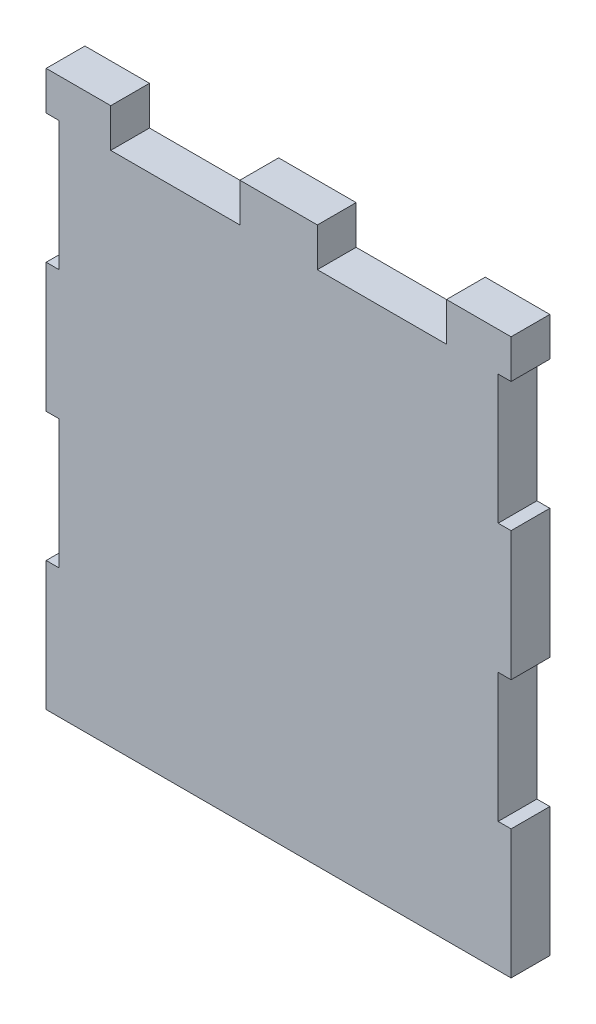
ISO-10303-21;
HEADER;
FILE_DESCRIPTION(('STEP AP214'),'2;1');
FILE_NAME('part.step','',(''),(''),'','','');
FILE_SCHEMA(('AUTOMOTIVE_DESIGN { 1 0 10303 214 1 1 1 1 }'));
ENDSEC;
DATA;
#1=APPLICATION_CONTEXT('core data for automotive mechanical design processes');
#2=APPLICATION_PROTOCOL_DEFINITION('international standard','automotive_design',2000,#1);
#3=PRODUCT_CONTEXT('',#1,'mechanical');
#4=PRODUCT('Part','Part','',(#3));
#5=PRODUCT_RELATED_PRODUCT_CATEGORY('part','',(#4));
#6=PRODUCT_DEFINITION_FORMATION('','',#4);
#7=PRODUCT_DEFINITION_CONTEXT('part definition',#1,'design');
#8=PRODUCT_DEFINITION('design','',#6,#7);
#9=PRODUCT_DEFINITION_SHAPE('','',#8);
#10=(LENGTH_UNIT() NAMED_UNIT(*) SI_UNIT(.MILLI.,.METRE.));
#11=(NAMED_UNIT(*) PLANE_ANGLE_UNIT() SI_UNIT($,.RADIAN.));
#12=(NAMED_UNIT(*) SI_UNIT($,.STERADIAN.) SOLID_ANGLE_UNIT());
#13=UNCERTAINTY_MEASURE_WITH_UNIT(LENGTH_MEASURE(1.E-05),#10,'distance_accuracy_value','');
#14=(GEOMETRIC_REPRESENTATION_CONTEXT(3) GLOBAL_UNCERTAINTY_ASSIGNED_CONTEXT((#13)) GLOBAL_UNIT_ASSIGNED_CONTEXT((#10,
#11,#12)) REPRESENTATION_CONTEXT('',''));
#15=CARTESIAN_POINT('',(0.,0.,0.));
#16=DIRECTION('',(0.,0.,1.));
#17=DIRECTION('',(1.,0.,0.));
#18=AXIS2_PLACEMENT_3D('',#15,#16,#17);
#19=CARTESIAN_POINT('',(0.,40.,3.));
#20=DIRECTION('',(0.,1.,0.));
#21=DIRECTION('',(0.,0.,1.));
#22=AXIS2_PLACEMENT_3D('',#19,#20,#21);
#23=PLANE('',#22);
#24=DIRECTION('',(1.,0.,0.));
#25=VECTOR('',#24,1.);
#26=CARTESIAN_POINT('',(0.,40.,0.));
#27=LINE('',#26,#25);
#28=CARTESIAN_POINT('',(21.,40.,0.));
#29=VERTEX_POINT('',#28);
#30=CARTESIAN_POINT('',(31.,40.,0.));
#31=VERTEX_POINT('',#30);
#32=EDGE_CURVE('E248',#29,#31,#27,.T.);
#33=ORIENTED_EDGE('',*,*,#32,.F.);
#34=DIRECTION('',(0.,0.,-1.));
#35=VECTOR('',#34,1.);
#36=CARTESIAN_POINT('',(21.,40.,3.));
#37=LINE('',#36,#35);
#38=CARTESIAN_POINT('',(21.,40.,3.));
#39=VERTEX_POINT('',#38);
#40=EDGE_CURVE('E11',#39,#29,#37,.T.);
#41=ORIENTED_EDGE('',*,*,#40,.F.);
#42=DIRECTION('',(1.,0.,0.));
#43=VECTOR('',#42,1.);
#44=CARTESIAN_POINT('',(0.,40.,3.));
#45=LINE('',#44,#43);
#46=CARTESIAN_POINT('',(31.,40.,3.));
#47=VERTEX_POINT('',#46);
#48=EDGE_CURVE('E322',#39,#47,#45,.T.);
#49=ORIENTED_EDGE('',*,*,#48,.T.);
#50=DIRECTION('',(0.,0.,-1.));
#51=VECTOR('',#50,1.);
#52=CARTESIAN_POINT('',(31.,40.,3.));
#53=LINE('',#52,#51);
#54=EDGE_CURVE('E51',#47,#31,#53,.T.);
#55=ORIENTED_EDGE('',*,*,#54,.T.);
#56=EDGE_LOOP('',(#33,#41,#49,#55));
#57=FACE_BOUND('',#56,.T.);
#58=ADVANCED_FACE('F35',(#57),#23,.T.);
#59=CARTESIAN_POINT('',(21.,0.,3.));
#60=DIRECTION('',(-1.,0.,0.));
#61=DIRECTION('',(0.,0.,1.));
#62=AXIS2_PLACEMENT_3D('',#59,#60,#61);
#63=PLANE('',#62);
#64=DIRECTION('',(0.,1.,0.));
#65=VECTOR('',#64,1.);
#66=CARTESIAN_POINT('',(21.,0.,0.));
#67=LINE('',#66,#65);
#68=CARTESIAN_POINT('',(21.,43.,0.));
#69=VERTEX_POINT('',#68);
#70=EDGE_CURVE('E250',#29,#69,#67,.T.);
#71=ORIENTED_EDGE('',*,*,#70,.T.);
#72=DIRECTION('',(0.,0.,-1.));
#73=VECTOR('',#72,1.);
#74=CARTESIAN_POINT('',(21.,43.,3.));
#75=LINE('',#74,#73);
#76=CARTESIAN_POINT('',(21.,43.,3.));
#77=VERTEX_POINT('',#76);
#78=EDGE_CURVE('E43',#77,#69,#75,.T.);
#79=ORIENTED_EDGE('',*,*,#78,.F.);
#80=DIRECTION('',(0.,1.,0.));
#81=VECTOR('',#80,1.);
#82=CARTESIAN_POINT('',(21.,0.,3.));
#83=LINE('',#82,#81);
#84=EDGE_CURVE('E394',#39,#77,#83,.T.);
#85=ORIENTED_EDGE('',*,*,#84,.F.);
#86=ORIENTED_EDGE('',*,*,#40,.T.);
#87=EDGE_LOOP('',(#71,#79,#85,#86));
#88=FACE_BOUND('',#87,.T.);
#89=ADVANCED_FACE('F381',(#88),#63,.F.);
#90=CARTESIAN_POINT('',(0.,43.,3.));
#91=DIRECTION('',(0.,1.,0.));
#92=DIRECTION('',(0.,0.,1.));
#93=AXIS2_PLACEMENT_3D('',#90,#91,#92);
#94=PLANE('',#93);
#95=DIRECTION('',(1.,0.,0.));
#96=VECTOR('',#95,1.);
#97=CARTESIAN_POINT('',(0.,43.,0.));
#98=LINE('',#97,#96);
#99=CARTESIAN_POINT('',(15.,43.,0.));
#100=VERTEX_POINT('',#99);
#101=EDGE_CURVE('E253',#100,#69,#98,.T.);
#102=ORIENTED_EDGE('',*,*,#101,.F.);
#103=DIRECTION('',(0.,0.,-1.));
#104=VECTOR('',#103,1.);
#105=CARTESIAN_POINT('',(15.,43.,3.));
#106=LINE('',#105,#104);
#107=CARTESIAN_POINT('',(15.,43.,3.));
#108=VERTEX_POINT('',#107);
#109=EDGE_CURVE('E371',#108,#100,#106,.T.);
#110=ORIENTED_EDGE('',*,*,#109,.F.);
#111=DIRECTION('',(1.,0.,0.));
#112=VECTOR('',#111,1.);
#113=CARTESIAN_POINT('',(0.,43.,3.));
#114=LINE('',#113,#112);
#115=EDGE_CURVE('E378',#108,#77,#114,.T.);
#116=ORIENTED_EDGE('',*,*,#115,.T.);
#117=ORIENTED_EDGE('',*,*,#78,.T.);
#118=EDGE_LOOP('',(#102,#110,#116,#117));
#119=FACE_BOUND('',#118,.T.);
#120=ADVANCED_FACE('F376',(#119),#94,.T.);
#121=CARTESIAN_POINT('',(15.,0.,3.));
#122=DIRECTION('',(-1.,0.,0.));
#123=DIRECTION('',(0.,0.,1.));
#124=AXIS2_PLACEMENT_3D('',#121,#122,#123);
#125=PLANE('',#124);
#126=DIRECTION('',(0.,1.,0.));
#127=VECTOR('',#126,1.);
#128=CARTESIAN_POINT('',(15.,0.,0.));
#129=LINE('',#128,#127);
#130=CARTESIAN_POINT('',(15.,40.,0.));
#131=VERTEX_POINT('',#130);
#132=EDGE_CURVE('E256',#131,#100,#129,.T.);
#133=ORIENTED_EDGE('',*,*,#132,.F.);
#134=DIRECTION('',(0.,0.,-1.));
#135=VECTOR('',#134,1.);
#136=CARTESIAN_POINT('',(15.,40.,3.));
#137=LINE('',#136,#135);
#138=CARTESIAN_POINT('',(15.,40.,3.));
#139=VERTEX_POINT('',#138);
#140=EDGE_CURVE('E369',#139,#131,#137,.T.);
#141=ORIENTED_EDGE('',*,*,#140,.F.);
#142=DIRECTION('',(0.,1.,0.));
#143=VECTOR('',#142,1.);
#144=CARTESIAN_POINT('',(15.,0.,3.));
#145=LINE('',#144,#143);
#146=EDGE_CURVE('E391',#139,#108,#145,.T.);
#147=ORIENTED_EDGE('',*,*,#146,.T.);
#148=ORIENTED_EDGE('',*,*,#109,.T.);
#149=EDGE_LOOP('',(#133,#141,#147,#148));
#150=FACE_BOUND('',#149,.T.);
#151=ADVANCED_FACE('F388',(#150),#125,.T.);
#152=CARTESIAN_POINT('',(0.,40.,3.));
#153=DIRECTION('',(0.,1.,0.));
#154=DIRECTION('',(0.,0.,1.));
#155=AXIS2_PLACEMENT_3D('',#152,#153,#154);
#156=PLANE('',#155);
#157=DIRECTION('',(1.,0.,0.));
#158=VECTOR('',#157,1.);
#159=CARTESIAN_POINT('',(0.,40.,0.));
#160=LINE('',#159,#158);
#161=CARTESIAN_POINT('',(5.,40.,0.));
#162=VERTEX_POINT('',#161);
#163=EDGE_CURVE('E259',#162,#131,#160,.T.);
#164=ORIENTED_EDGE('',*,*,#163,.F.);
#165=DIRECTION('',(0.,0.,-1.));
#166=VECTOR('',#165,1.);
#167=CARTESIAN_POINT('',(5.,40.,3.));
#168=LINE('',#167,#166);
#169=CARTESIAN_POINT('',(5.,40.,3.));
#170=VERTEX_POINT('',#169);
#171=EDGE_CURVE('E367',#170,#162,#168,.T.);
#172=ORIENTED_EDGE('',*,*,#171,.F.);
#173=DIRECTION('',(1.,0.,0.));
#174=VECTOR('',#173,1.);
#175=CARTESIAN_POINT('',(0.,40.,3.));
#176=LINE('',#175,#174);
#177=EDGE_CURVE('E396',#170,#139,#176,.T.);
#178=ORIENTED_EDGE('',*,*,#177,.T.);
#179=ORIENTED_EDGE('',*,*,#140,.T.);
#180=EDGE_LOOP('',(#164,#172,#178,#179));
#181=FACE_BOUND('',#180,.T.);
#182=ADVANCED_FACE('F480',(#181),#156,.T.);
#183=CARTESIAN_POINT('',(5.,0.,3.));
#184=DIRECTION('',(-1.,0.,0.));
#185=DIRECTION('',(0.,0.,1.));
#186=AXIS2_PLACEMENT_3D('',#183,#184,#185);
#187=PLANE('',#186);
#188=DIRECTION('',(0.,1.,0.));
#189=VECTOR('',#188,1.);
#190=CARTESIAN_POINT('',(5.,0.,0.));
#191=LINE('',#190,#189);
#192=CARTESIAN_POINT('',(5.,43.,0.));
#193=VERTEX_POINT('',#192);
#194=EDGE_CURVE('E262',#162,#193,#191,.T.);
#195=ORIENTED_EDGE('',*,*,#194,.T.);
#196=DIRECTION('',(0.,0.,-1.));
#197=VECTOR('',#196,1.);
#198=CARTESIAN_POINT('',(5.,43.,3.));
#199=LINE('',#198,#197);
#200=CARTESIAN_POINT('',(5.,43.,3.));
#201=VERTEX_POINT('',#200);
#202=EDGE_CURVE('E365',#201,#193,#199,.T.);
#203=ORIENTED_EDGE('',*,*,#202,.F.);
#204=DIRECTION('',(0.,1.,0.));
#205=VECTOR('',#204,1.);
#206=CARTESIAN_POINT('',(5.,0.,3.));
#207=LINE('',#206,#205);
#208=EDGE_CURVE('E402',#170,#201,#207,.T.);
#209=ORIENTED_EDGE('',*,*,#208,.F.);
#210=ORIENTED_EDGE('',*,*,#171,.T.);
#211=EDGE_LOOP('',(#195,#203,#209,#210));
#212=FACE_BOUND('',#211,.T.);
#213=ADVANCED_FACE('F483',(#212),#187,.F.);
#214=CARTESIAN_POINT('',(0.,43.,3.));
#215=DIRECTION('',(0.,1.,0.));
#216=DIRECTION('',(0.,0.,1.));
#217=AXIS2_PLACEMENT_3D('',#214,#215,#216);
#218=PLANE('',#217);
#219=DIRECTION('',(1.,0.,0.));
#220=VECTOR('',#219,1.);
#221=CARTESIAN_POINT('',(0.,43.,0.));
#222=LINE('',#221,#220);
#223=CARTESIAN_POINT('',(0.,43.,0.));
#224=VERTEX_POINT('',#223);
#225=EDGE_CURVE('E265',#224,#193,#222,.T.);
#226=ORIENTED_EDGE('',*,*,#225,.F.);
#227=DIRECTION('',(0.,0.,-1.));
#228=VECTOR('',#227,1.);
#229=CARTESIAN_POINT('',(0.,43.,3.));
#230=LINE('',#229,#228);
#231=CARTESIAN_POINT('',(0.,43.,3.));
#232=VERTEX_POINT('',#231);
#233=EDGE_CURVE('E363',#232,#224,#230,.T.);
#234=ORIENTED_EDGE('',*,*,#233,.F.);
#235=DIRECTION('',(1.,0.,0.));
#236=VECTOR('',#235,1.);
#237=CARTESIAN_POINT('',(0.,43.,3.));
#238=LINE('',#237,#236);
#239=EDGE_CURVE('E404',#232,#201,#238,.T.);
#240=ORIENTED_EDGE('',*,*,#239,.T.);
#241=ORIENTED_EDGE('',*,*,#202,.T.);
#242=EDGE_LOOP('',(#226,#234,#240,#241));
#243=FACE_BOUND('',#242,.T.);
#244=ADVANCED_FACE('F487',(#243),#218,.T.);
#245=CARTESIAN_POINT('',(0.,0.,3.));
#246=DIRECTION('',(-1.,0.,0.));
#247=DIRECTION('',(0.,0.,1.));
#248=AXIS2_PLACEMENT_3D('',#245,#246,#247);
#249=PLANE('',#248);
#250=DIRECTION('',(0.,1.,0.));
#251=VECTOR('',#250,1.);
#252=CARTESIAN_POINT('',(0.,0.,0.));
#253=LINE('',#252,#251);
#254=CARTESIAN_POINT('',(0.,40.,0.));
#255=VERTEX_POINT('',#254);
#256=EDGE_CURVE('E268',#255,#224,#253,.T.);
#257=ORIENTED_EDGE('',*,*,#256,.F.);
#258=DIRECTION('',(0.,0.,-1.));
#259=VECTOR('',#258,1.);
#260=CARTESIAN_POINT('',(0.,40.,3.));
#261=LINE('',#260,#259);
#262=CARTESIAN_POINT('',(0.,40.,3.));
#263=VERTEX_POINT('',#262);
#264=EDGE_CURVE('E361',#263,#255,#261,.T.);
#265=ORIENTED_EDGE('',*,*,#264,.F.);
#266=DIRECTION('',(0.,1.,0.));
#267=VECTOR('',#266,1.);
#268=CARTESIAN_POINT('',(0.,0.,3.));
#269=LINE('',#268,#267);
#270=EDGE_CURVE('E407',#263,#232,#269,.T.);
#271=ORIENTED_EDGE('',*,*,#270,.T.);
#272=ORIENTED_EDGE('',*,*,#233,.T.);
#273=EDGE_LOOP('',(#257,#265,#271,#272));
#274=FACE_BOUND('',#273,.T.);
#275=ADVANCED_FACE('F491',(#274),#249,.T.);
#276=CARTESIAN_POINT('',(0.,40.,3.));
#277=DIRECTION('',(0.,1.,0.));
#278=DIRECTION('',(0.,0.,1.));
#279=AXIS2_PLACEMENT_3D('',#276,#277,#278);
#280=PLANE('',#279);
#281=DIRECTION('',(1.,0.,0.));
#282=VECTOR('',#281,1.);
#283=CARTESIAN_POINT('',(0.,40.,0.));
#284=LINE('',#283,#282);
#285=CARTESIAN_POINT('',(1.,40.,0.));
#286=VERTEX_POINT('',#285);
#287=EDGE_CURVE('E271',#255,#286,#284,.T.);
#288=ORIENTED_EDGE('',*,*,#287,.T.);
#289=DIRECTION('',(0.,0.,-1.));
#290=VECTOR('',#289,1.);
#291=CARTESIAN_POINT('',(1.,40.,3.));
#292=LINE('',#291,#290);
#293=CARTESIAN_POINT('',(1.,40.,3.));
#294=VERTEX_POINT('',#293);
#295=EDGE_CURVE('E359',#294,#286,#292,.T.);
#296=ORIENTED_EDGE('',*,*,#295,.F.);
#297=DIRECTION('',(1.,0.,0.));
#298=VECTOR('',#297,1.);
#299=CARTESIAN_POINT('',(0.,40.,3.));
#300=LINE('',#299,#298);
#301=EDGE_CURVE('E410',#263,#294,#300,.T.);
#302=ORIENTED_EDGE('',*,*,#301,.F.);
#303=ORIENTED_EDGE('',*,*,#264,.T.);
#304=EDGE_LOOP('',(#288,#296,#302,#303));
#305=FACE_BOUND('',#304,.T.);
#306=ADVANCED_FACE('F495',(#305),#280,.F.);
#307=CARTESIAN_POINT('',(1.,0.,3.));
#308=DIRECTION('',(-1.,0.,0.));
#309=DIRECTION('',(0.,0.,1.));
#310=AXIS2_PLACEMENT_3D('',#307,#308,#309);
#311=PLANE('',#310);
#312=DIRECTION('',(0.,1.,0.));
#313=VECTOR('',#312,1.);
#314=CARTESIAN_POINT('',(1.,0.,0.));
#315=LINE('',#314,#313);
#316=CARTESIAN_POINT('',(1.,30.,0.));
#317=VERTEX_POINT('',#316);
#318=EDGE_CURVE('E274',#317,#286,#315,.T.);
#319=ORIENTED_EDGE('',*,*,#318,.F.);
#320=DIRECTION('',(0.,0.,-1.));
#321=VECTOR('',#320,1.);
#322=CARTESIAN_POINT('',(1.,30.,3.));
#323=LINE('',#322,#321);
#324=CARTESIAN_POINT('',(1.,30.,3.));
#325=VERTEX_POINT('',#324);
#326=EDGE_CURVE('E357',#325,#317,#323,.T.);
#327=ORIENTED_EDGE('',*,*,#326,.F.);
#328=DIRECTION('',(0.,1.,0.));
#329=VECTOR('',#328,1.);
#330=CARTESIAN_POINT('',(1.,0.,3.));
#331=LINE('',#330,#329);
#332=EDGE_CURVE('E412',#325,#294,#331,.T.);
#333=ORIENTED_EDGE('',*,*,#332,.T.);
#334=ORIENTED_EDGE('',*,*,#295,.T.);
#335=EDGE_LOOP('',(#319,#327,#333,#334));
#336=FACE_BOUND('',#335,.T.);
#337=ADVANCED_FACE('F499',(#336),#311,.T.);
#338=CARTESIAN_POINT('',(0.,30.,3.));
#339=DIRECTION('',(0.,1.,0.));
#340=DIRECTION('',(0.,0.,1.));
#341=AXIS2_PLACEMENT_3D('',#338,#339,#340);
#342=PLANE('',#341);
#343=DIRECTION('',(1.,0.,0.));
#344=VECTOR('',#343,1.);
#345=CARTESIAN_POINT('',(0.,30.,0.));
#346=LINE('',#345,#344);
#347=CARTESIAN_POINT('',(0.,30.,0.));
#348=VERTEX_POINT('',#347);
#349=EDGE_CURVE('E277',#348,#317,#346,.T.);
#350=ORIENTED_EDGE('',*,*,#349,.F.);
#351=DIRECTION('',(0.,0.,-1.));
#352=VECTOR('',#351,1.);
#353=CARTESIAN_POINT('',(0.,30.,3.));
#354=LINE('',#353,#352);
#355=CARTESIAN_POINT('',(0.,30.,3.));
#356=VERTEX_POINT('',#355);
#357=EDGE_CURVE('E355',#356,#348,#354,.T.);
#358=ORIENTED_EDGE('',*,*,#357,.F.);
#359=DIRECTION('',(1.,0.,0.));
#360=VECTOR('',#359,1.);
#361=CARTESIAN_POINT('',(0.,30.,3.));
#362=LINE('',#361,#360);
#363=EDGE_CURVE('E415',#356,#325,#362,.T.);
#364=ORIENTED_EDGE('',*,*,#363,.T.);
#365=ORIENTED_EDGE('',*,*,#326,.T.);
#366=EDGE_LOOP('',(#350,#358,#364,#365));
#367=FACE_BOUND('',#366,.T.);
#368=ADVANCED_FACE('F501',(#367),#342,.T.);
#369=CARTESIAN_POINT('',(0.,0.,3.));
#370=DIRECTION('',(-1.,0.,0.));
#371=DIRECTION('',(0.,0.,1.));
#372=AXIS2_PLACEMENT_3D('',#369,#370,#371);
#373=PLANE('',#372);
#374=DIRECTION('',(0.,1.,0.));
#375=VECTOR('',#374,1.);
#376=CARTESIAN_POINT('',(0.,0.,0.));
#377=LINE('',#376,#375);
#378=CARTESIAN_POINT('',(0.,20.,0.));
#379=VERTEX_POINT('',#378);
#380=EDGE_CURVE('E281',#379,#348,#377,.T.);
#381=ORIENTED_EDGE('',*,*,#380,.F.);
#382=DIRECTION('',(0.,0.,-1.));
#383=VECTOR('',#382,1.);
#384=CARTESIAN_POINT('',(0.,20.,3.));
#385=LINE('',#384,#383);
#386=CARTESIAN_POINT('',(0.,20.,3.));
#387=VERTEX_POINT('',#386);
#388=EDGE_CURVE('E353',#387,#379,#385,.T.);
#389=ORIENTED_EDGE('',*,*,#388,.F.);
#390=DIRECTION('',(0.,1.,0.));
#391=VECTOR('',#390,1.);
#392=CARTESIAN_POINT('',(0.,0.,3.));
#393=LINE('',#392,#391);
#394=EDGE_CURVE('E419',#387,#356,#393,.T.);
#395=ORIENTED_EDGE('',*,*,#394,.T.);
#396=ORIENTED_EDGE('',*,*,#357,.T.);
#397=EDGE_LOOP('',(#381,#389,#395,#396));
#398=FACE_BOUND('',#397,.T.);
#399=ADVANCED_FACE('F504',(#398),#373,.T.);
#400=CARTESIAN_POINT('',(0.,20.,3.));
#401=DIRECTION('',(0.,1.,0.));
#402=DIRECTION('',(0.,0.,1.));
#403=AXIS2_PLACEMENT_3D('',#400,#401,#402);
#404=PLANE('',#403);
#405=DIRECTION('',(1.,0.,0.));
#406=VECTOR('',#405,1.);
#407=CARTESIAN_POINT('',(0.,20.,0.));
#408=LINE('',#407,#406);
#409=CARTESIAN_POINT('',(1.,20.,0.));
#410=VERTEX_POINT('',#409);
#411=EDGE_CURVE('E284',#379,#410,#408,.T.);
#412=ORIENTED_EDGE('',*,*,#411,.T.);
#413=DIRECTION('',(0.,0.,-1.));
#414=VECTOR('',#413,1.);
#415=CARTESIAN_POINT('',(1.,20.,3.));
#416=LINE('',#415,#414);
#417=CARTESIAN_POINT('',(1.,20.,3.));
#418=VERTEX_POINT('',#417);
#419=EDGE_CURVE('E351',#418,#410,#416,.T.);
#420=ORIENTED_EDGE('',*,*,#419,.F.);
#421=DIRECTION('',(1.,0.,0.));
#422=VECTOR('',#421,1.);
#423=CARTESIAN_POINT('',(0.,20.,3.));
#424=LINE('',#423,#422);
#425=EDGE_CURVE('E422',#387,#418,#424,.T.);
#426=ORIENTED_EDGE('',*,*,#425,.F.);
#427=ORIENTED_EDGE('',*,*,#388,.T.);
#428=EDGE_LOOP('',(#412,#420,#426,#427));
#429=FACE_BOUND('',#428,.T.);
#430=ADVANCED_FACE('F508',(#429),#404,.F.);
#431=CARTESIAN_POINT('',(1.,10.,0.));
#432=VERTEX_POINT('',#431);
#433=EDGE_CURVE('E278',#432,#410,#315,.T.);
#434=ORIENTED_EDGE('',*,*,#433,.F.);
#435=DIRECTION('',(0.,0.,-1.));
#436=VECTOR('',#435,1.);
#437=CARTESIAN_POINT('',(1.,10.,3.));
#438=LINE('',#437,#436);
#439=CARTESIAN_POINT('',(1.,10.,3.));
#440=VERTEX_POINT('',#439);
#441=EDGE_CURVE('E349',#440,#432,#438,.T.);
#442=ORIENTED_EDGE('',*,*,#441,.F.);
#443=EDGE_CURVE('E416',#440,#418,#331,.T.);
#444=ORIENTED_EDGE('',*,*,#443,.T.);
#445=ORIENTED_EDGE('',*,*,#419,.T.);
#446=EDGE_LOOP('',(#434,#442,#444,#445));
#447=FACE_BOUND('',#446,.T.);
#448=ADVANCED_FACE('F512',(#447),#311,.T.);
#449=CARTESIAN_POINT('',(0.,10.,3.));
#450=DIRECTION('',(0.,1.,0.));
#451=DIRECTION('',(0.,0.,1.));
#452=AXIS2_PLACEMENT_3D('',#449,#450,#451);
#453=PLANE('',#452);
#454=DIRECTION('',(1.,0.,0.));
#455=VECTOR('',#454,1.);
#456=CARTESIAN_POINT('',(0.,10.,0.));
#457=LINE('',#456,#455);
#458=CARTESIAN_POINT('',(0.,10.,0.));
#459=VERTEX_POINT('',#458);
#460=EDGE_CURVE('E287',#459,#432,#457,.T.);
#461=ORIENTED_EDGE('',*,*,#460,.F.);
#462=DIRECTION('',(0.,0.,-1.));
#463=VECTOR('',#462,1.);
#464=CARTESIAN_POINT('',(0.,10.,3.));
#465=LINE('',#464,#463);
#466=CARTESIAN_POINT('',(0.,10.,3.));
#467=VERTEX_POINT('',#466);
#468=EDGE_CURVE('E347',#467,#459,#465,.T.);
#469=ORIENTED_EDGE('',*,*,#468,.F.);
#470=DIRECTION('',(1.,0.,0.));
#471=VECTOR('',#470,1.);
#472=CARTESIAN_POINT('',(0.,10.,3.));
#473=LINE('',#472,#471);
#474=EDGE_CURVE('E424',#467,#440,#473,.T.);
#475=ORIENTED_EDGE('',*,*,#474,.T.);
#476=ORIENTED_EDGE('',*,*,#441,.T.);
#477=EDGE_LOOP('',(#461,#469,#475,#476));
#478=FACE_BOUND('',#477,.T.);
#479=ADVANCED_FACE('F516',(#478),#453,.T.);
#480=CARTESIAN_POINT('',(0.,0.,3.));
#481=DIRECTION('',(-1.,0.,0.));
#482=DIRECTION('',(0.,0.,1.));
#483=AXIS2_PLACEMENT_3D('',#480,#481,#482);
#484=PLANE('',#483);
#485=DIRECTION('',(0.,1.,0.));
#486=VECTOR('',#485,1.);
#487=CARTESIAN_POINT('',(0.,0.,0.));
#488=LINE('',#487,#486);
#489=CARTESIAN_POINT('',(0.,0.,0.));
#490=VERTEX_POINT('',#489);
#491=EDGE_CURVE('E290',#490,#459,#488,.T.);
#492=ORIENTED_EDGE('',*,*,#491,.F.);
#493=DIRECTION('',(0.,0.,-1.));
#494=VECTOR('',#493,1.);
#495=CARTESIAN_POINT('',(0.,0.,3.));
#496=LINE('',#495,#494);
#497=CARTESIAN_POINT('',(0.,0.,3.));
#498=VERTEX_POINT('',#497);
#499=EDGE_CURVE('E345',#498,#490,#496,.T.);
#500=ORIENTED_EDGE('',*,*,#499,.F.);
#501=DIRECTION('',(0.,1.,0.));
#502=VECTOR('',#501,1.);
#503=CARTESIAN_POINT('',(0.,0.,3.));
#504=LINE('',#503,#502);
#505=EDGE_CURVE('E427',#498,#467,#504,.T.);
#506=ORIENTED_EDGE('',*,*,#505,.T.);
#507=ORIENTED_EDGE('',*,*,#468,.T.);
#508=EDGE_LOOP('',(#492,#500,#506,#507));
#509=FACE_BOUND('',#508,.T.);
#510=ADVANCED_FACE('F520',(#509),#484,.T.);
#511=CARTESIAN_POINT('',(0.,0.,3.));
#512=DIRECTION('',(0.,-1.,0.));
#513=DIRECTION('',(1.,0.,0.));
#514=AXIS2_PLACEMENT_3D('',#511,#512,#513);
#515=PLANE('',#514);
#516=DIRECTION('',(-1.,0.,0.));
#517=VECTOR('',#516,1.);
#518=CARTESIAN_POINT('',(0.,0.,0.));
#519=LINE('',#518,#517);
#520=CARTESIAN_POINT('',(36.,0.,0.));
#521=VERTEX_POINT('',#520);
#522=EDGE_CURVE('E293',#521,#490,#519,.T.);
#523=ORIENTED_EDGE('',*,*,#522,.F.);
#524=DIRECTION('',(0.,0.,-1.));
#525=VECTOR('',#524,1.);
#526=CARTESIAN_POINT('',(36.,0.,3.));
#527=LINE('',#526,#525);
#528=CARTESIAN_POINT('',(36.,0.,3.));
#529=VERTEX_POINT('',#528);
#530=EDGE_CURVE('E343',#529,#521,#527,.T.);
#531=ORIENTED_EDGE('',*,*,#530,.F.);
#532=DIRECTION('',(-1.,0.,0.));
#533=VECTOR('',#532,1.);
#534=CARTESIAN_POINT('',(0.,0.,3.));
#535=LINE('',#534,#533);
#536=EDGE_CURVE('E430',#529,#498,#535,.T.);
#537=ORIENTED_EDGE('',*,*,#536,.T.);
#538=ORIENTED_EDGE('',*,*,#499,.T.);
#539=EDGE_LOOP('',(#523,#531,#537,#538));
#540=FACE_BOUND('',#539,.T.);
#541=ADVANCED_FACE('F524',(#540),#515,.T.);
#542=CARTESIAN_POINT('',(36.,0.,3.));
#543=DIRECTION('',(1.,0.,0.));
#544=DIRECTION('',(0.,1.,0.));
#545=AXIS2_PLACEMENT_3D('',#542,#543,#544);
#546=PLANE('',#545);
#547=DIRECTION('',(0.,-1.,0.));
#548=VECTOR('',#547,1.);
#549=CARTESIAN_POINT('',(36.,0.,0.));
#550=LINE('',#549,#548);
#551=CARTESIAN_POINT('',(36.,10.,0.));
#552=VERTEX_POINT('',#551);
#553=EDGE_CURVE('E296',#552,#521,#550,.T.);
#554=ORIENTED_EDGE('',*,*,#553,.F.);
#555=DIRECTION('',(0.,0.,-1.));
#556=VECTOR('',#555,1.);
#557=CARTESIAN_POINT('',(36.,10.,3.));
#558=LINE('',#557,#556);
#559=CARTESIAN_POINT('',(36.,10.,3.));
#560=VERTEX_POINT('',#559);
#561=EDGE_CURVE('E341',#560,#552,#558,.T.);
#562=ORIENTED_EDGE('',*,*,#561,.F.);
#563=DIRECTION('',(0.,-1.,0.));
#564=VECTOR('',#563,1.);
#565=CARTESIAN_POINT('',(36.,0.,3.));
#566=LINE('',#565,#564);
#567=EDGE_CURVE('E433',#560,#529,#566,.T.);
#568=ORIENTED_EDGE('',*,*,#567,.T.);
#569=ORIENTED_EDGE('',*,*,#530,.T.);
#570=EDGE_LOOP('',(#554,#562,#568,#569));
#571=FACE_BOUND('',#570,.T.);
#572=ADVANCED_FACE('F528',(#571),#546,.T.);
#573=CARTESIAN_POINT('',(0.,9.99999999999988,3.));
#574=DIRECTION('',(0.,-1.,0.));
#575=DIRECTION('',(1.,0.,0.));
#576=AXIS2_PLACEMENT_3D('',#573,#574,#575);
#577=PLANE('',#576);
#578=DIRECTION('',(-1.,0.,0.));
#579=VECTOR('',#578,1.);
#580=CARTESIAN_POINT('',(0.,9.99999999999988,0.));
#581=LINE('',#580,#579);
#582=CARTESIAN_POINT('',(35.,10.,0.));
#583=VERTEX_POINT('',#582);
#584=EDGE_CURVE('E299',#552,#583,#581,.T.);
#585=ORIENTED_EDGE('',*,*,#584,.T.);
#586=DIRECTION('',(0.,0.,-1.));
#587=VECTOR('',#586,1.);
#588=CARTESIAN_POINT('',(35.,10.,3.));
#589=LINE('',#588,#587);
#590=CARTESIAN_POINT('',(35.,10.,3.));
#591=VERTEX_POINT('',#590);
#592=EDGE_CURVE('E338',#591,#583,#589,.T.);
#593=ORIENTED_EDGE('',*,*,#592,.F.);
#594=DIRECTION('',(-1.,0.,0.));
#595=VECTOR('',#594,1.);
#596=CARTESIAN_POINT('',(0.,9.99999999999988,3.));
#597=LINE('',#596,#595);
#598=EDGE_CURVE('E436',#560,#591,#597,.T.);
#599=ORIENTED_EDGE('',*,*,#598,.F.);
#600=ORIENTED_EDGE('',*,*,#561,.T.);
#601=EDGE_LOOP('',(#585,#593,#599,#600));
#602=FACE_BOUND('',#601,.T.);
#603=ADVANCED_FACE('F532',(#602),#577,.F.);
#604=CARTESIAN_POINT('',(35.,0.,3.));
#605=DIRECTION('',(-1.,0.,0.));
#606=DIRECTION('',(0.,0.,1.));
#607=AXIS2_PLACEMENT_3D('',#604,#605,#606);
#608=PLANE('',#607);
#609=DIRECTION('',(0.,1.,0.));
#610=VECTOR('',#609,1.);
#611=CARTESIAN_POINT('',(35.,0.,0.));
#612=LINE('',#611,#610);
#613=CARTESIAN_POINT('',(35.,20.,0.));
#614=VERTEX_POINT('',#613);
#615=EDGE_CURVE('E301',#583,#614,#612,.T.);
#616=ORIENTED_EDGE('',*,*,#615,.T.);
#617=DIRECTION('',(0.,0.,-1.));
#618=VECTOR('',#617,1.);
#619=CARTESIAN_POINT('',(35.,20.,3.));
#620=LINE('',#619,#618);
#621=CARTESIAN_POINT('',(35.,20.,3.));
#622=VERTEX_POINT('',#621);
#623=EDGE_CURVE('E336',#622,#614,#620,.T.);
#624=ORIENTED_EDGE('',*,*,#623,.F.);
#625=DIRECTION('',(0.,1.,0.));
#626=VECTOR('',#625,1.);
#627=CARTESIAN_POINT('',(35.,0.,3.));
#628=LINE('',#627,#626);
#629=EDGE_CURVE('E438',#591,#622,#628,.T.);
#630=ORIENTED_EDGE('',*,*,#629,.F.);
#631=ORIENTED_EDGE('',*,*,#592,.T.);
#632=EDGE_LOOP('',(#616,#624,#630,#631));
#633=FACE_BOUND('',#632,.T.);
#634=ADVANCED_FACE('F536',(#633),#608,.F.);
#635=CARTESIAN_POINT('',(0.,20.,3.));
#636=DIRECTION('',(0.,-1.,0.));
#637=DIRECTION('',(0.,0.,-1.));
#638=AXIS2_PLACEMENT_3D('',#635,#636,#637);
#639=PLANE('',#638);
#640=DIRECTION('',(-1.,0.,0.));
#641=VECTOR('',#640,1.);
#642=CARTESIAN_POINT('',(0.,20.,0.));
#643=LINE('',#642,#641);
#644=CARTESIAN_POINT('',(36.,20.,0.));
#645=VERTEX_POINT('',#644);
#646=EDGE_CURVE('E304',#645,#614,#643,.T.);
#647=ORIENTED_EDGE('',*,*,#646,.F.);
#648=DIRECTION('',(0.,0.,-1.));
#649=VECTOR('',#648,1.);
#650=CARTESIAN_POINT('',(36.,20.,3.));
#651=LINE('',#650,#649);
#652=CARTESIAN_POINT('',(36.,20.,3.));
#653=VERTEX_POINT('',#652);
#654=EDGE_CURVE('E334',#653,#645,#651,.T.);
#655=ORIENTED_EDGE('',*,*,#654,.F.);
#656=DIRECTION('',(-1.,0.,0.));
#657=VECTOR('',#656,1.);
#658=CARTESIAN_POINT('',(0.,20.,3.));
#659=LINE('',#658,#657);
#660=EDGE_CURVE('E440',#653,#622,#659,.T.);
#661=ORIENTED_EDGE('',*,*,#660,.T.);
#662=ORIENTED_EDGE('',*,*,#623,.T.);
#663=EDGE_LOOP('',(#647,#655,#661,#662));
#664=FACE_BOUND('',#663,.T.);
#665=ADVANCED_FACE('F538',(#664),#639,.T.);
#666=CARTESIAN_POINT('',(36.,0.,3.));
#667=DIRECTION('',(1.,0.,0.));
#668=DIRECTION('',(0.,1.,0.));
#669=AXIS2_PLACEMENT_3D('',#666,#667,#668);
#670=PLANE('',#669);
#671=DIRECTION('',(0.,-1.,0.));
#672=VECTOR('',#671,1.);
#673=CARTESIAN_POINT('',(36.,0.,0.));
#674=LINE('',#673,#672);
#675=CARTESIAN_POINT('',(36.,30.,0.));
#676=VERTEX_POINT('',#675);
#677=EDGE_CURVE('E308',#676,#645,#674,.T.);
#678=ORIENTED_EDGE('',*,*,#677,.F.);
#679=DIRECTION('',(0.,0.,-1.));
#680=VECTOR('',#679,1.);
#681=CARTESIAN_POINT('',(36.,30.,3.));
#682=LINE('',#681,#680);
#683=CARTESIAN_POINT('',(36.,30.,3.));
#684=VERTEX_POINT('',#683);
#685=EDGE_CURVE('E332',#684,#676,#682,.T.);
#686=ORIENTED_EDGE('',*,*,#685,.F.);
#687=DIRECTION('',(0.,-1.,0.));
#688=VECTOR('',#687,1.);
#689=CARTESIAN_POINT('',(36.,0.,3.));
#690=LINE('',#689,#688);
#691=EDGE_CURVE('E444',#684,#653,#690,.T.);
#692=ORIENTED_EDGE('',*,*,#691,.T.);
#693=ORIENTED_EDGE('',*,*,#654,.T.);
#694=EDGE_LOOP('',(#678,#686,#692,#693));
#695=FACE_BOUND('',#694,.T.);
#696=ADVANCED_FACE('F541',(#695),#670,.T.);
#697=CARTESIAN_POINT('',(0.,30.,3.));
#698=DIRECTION('',(0.,-1.,0.));
#699=DIRECTION('',(0.,0.,-1.));
#700=AXIS2_PLACEMENT_3D('',#697,#698,#699);
#701=PLANE('',#700);
#702=DIRECTION('',(-1.,0.,0.));
#703=VECTOR('',#702,1.);
#704=CARTESIAN_POINT('',(0.,30.,0.));
#705=LINE('',#704,#703);
#706=CARTESIAN_POINT('',(35.,30.,0.));
#707=VERTEX_POINT('',#706);
#708=EDGE_CURVE('E311',#676,#707,#705,.T.);
#709=ORIENTED_EDGE('',*,*,#708,.T.);
#710=DIRECTION('',(0.,0.,-1.));
#711=VECTOR('',#710,1.);
#712=CARTESIAN_POINT('',(35.,30.,3.));
#713=LINE('',#712,#711);
#714=CARTESIAN_POINT('',(35.,30.,3.));
#715=VERTEX_POINT('',#714);
#716=EDGE_CURVE('E329',#715,#707,#713,.T.);
#717=ORIENTED_EDGE('',*,*,#716,.F.);
#718=DIRECTION('',(-1.,0.,0.));
#719=VECTOR('',#718,1.);
#720=CARTESIAN_POINT('',(0.,30.,3.));
#721=LINE('',#720,#719);
#722=EDGE_CURVE('E447',#684,#715,#721,.T.);
#723=ORIENTED_EDGE('',*,*,#722,.F.);
#724=ORIENTED_EDGE('',*,*,#685,.T.);
#725=EDGE_LOOP('',(#709,#717,#723,#724));
#726=FACE_BOUND('',#725,.T.);
#727=ADVANCED_FACE('F545',(#726),#701,.F.);
#728=CARTESIAN_POINT('',(35.,40.,0.));
#729=VERTEX_POINT('',#728);
#730=EDGE_CURVE('E305',#707,#729,#612,.T.);
#731=ORIENTED_EDGE('',*,*,#730,.T.);
#732=DIRECTION('',(0.,0.,-1.));
#733=VECTOR('',#732,1.);
#734=CARTESIAN_POINT('',(35.,40.,3.));
#735=LINE('',#734,#733);
#736=CARTESIAN_POINT('',(35.,40.,3.));
#737=VERTEX_POINT('',#736);
#738=EDGE_CURVE('E326',#737,#729,#735,.T.);
#739=ORIENTED_EDGE('',*,*,#738,.F.);
#740=EDGE_CURVE('E441',#715,#737,#628,.T.);
#741=ORIENTED_EDGE('',*,*,#740,.F.);
#742=ORIENTED_EDGE('',*,*,#716,.T.);
#743=EDGE_LOOP('',(#731,#739,#741,#742));
#744=FACE_BOUND('',#743,.T.);
#745=ADVANCED_FACE('F454',(#744),#608,.F.);
#746=CARTESIAN_POINT('',(0.,40.,3.));
#747=DIRECTION('',(0.,1.,0.));
#748=DIRECTION('',(0.,0.,1.));
#749=AXIS2_PLACEMENT_3D('',#746,#747,#748);
#750=PLANE('',#749);
#751=DIRECTION('',(1.,0.,0.));
#752=VECTOR('',#751,1.);
#753=CARTESIAN_POINT('',(0.,40.,0.));
#754=LINE('',#753,#752);
#755=CARTESIAN_POINT('',(36.,40.,0.));
#756=VERTEX_POINT('',#755);
#757=EDGE_CURVE('E313',#729,#756,#754,.T.);
#758=ORIENTED_EDGE('',*,*,#757,.T.);
#759=DIRECTION('',(0.,0.,-1.));
#760=VECTOR('',#759,1.);
#761=CARTESIAN_POINT('',(36.,40.,3.));
#762=LINE('',#761,#760);
#763=CARTESIAN_POINT('',(36.,40.,3.));
#764=VERTEX_POINT('',#763);
#765=EDGE_CURVE('E230',#764,#756,#762,.T.);
#766=ORIENTED_EDGE('',*,*,#765,.F.);
#767=DIRECTION('',(1.,0.,0.));
#768=VECTOR('',#767,1.);
#769=CARTESIAN_POINT('',(0.,40.,3.));
#770=LINE('',#769,#768);
#771=EDGE_CURVE('E239',#737,#764,#770,.T.);
#772=ORIENTED_EDGE('',*,*,#771,.F.);
#773=ORIENTED_EDGE('',*,*,#738,.T.);
#774=EDGE_LOOP('',(#758,#766,#772,#773));
#775=FACE_BOUND('',#774,.T.);
#776=ADVANCED_FACE('F458',(#775),#750,.F.);
#777=CARTESIAN_POINT('',(36.,0.,3.));
#778=DIRECTION('',(1.,0.,0.));
#779=DIRECTION('',(0.,0.,-1.));
#780=AXIS2_PLACEMENT_3D('',#777,#778,#779);
#781=PLANE('',#780);
#782=DIRECTION('',(0.,-1.,0.));
#783=VECTOR('',#782,1.);
#784=CARTESIAN_POINT('',(36.,0.,0.));
#785=LINE('',#784,#783);
#786=CARTESIAN_POINT('',(36.,43.,0.));
#787=VERTEX_POINT('',#786);
#788=EDGE_CURVE('E226',#787,#756,#785,.T.);
#789=ORIENTED_EDGE('',*,*,#788,.F.);
#790=DIRECTION('',(0.,0.,-1.));
#791=VECTOR('',#790,1.);
#792=CARTESIAN_POINT('',(36.,43.,3.));
#793=LINE('',#792,#791);
#794=CARTESIAN_POINT('',(36.,43.,3.));
#795=VERTEX_POINT('',#794);
#796=EDGE_CURVE('E221',#795,#787,#793,.T.);
#797=ORIENTED_EDGE('',*,*,#796,.F.);
#798=DIRECTION('',(0.,-1.,0.));
#799=VECTOR('',#798,1.);
#800=CARTESIAN_POINT('',(36.,0.,3.));
#801=LINE('',#800,#799);
#802=EDGE_CURVE('E224',#795,#764,#801,.T.);
#803=ORIENTED_EDGE('',*,*,#802,.T.);
#804=ORIENTED_EDGE('',*,*,#765,.T.);
#805=EDGE_LOOP('',(#789,#797,#803,#804));
#806=FACE_BOUND('',#805,.T.);
#807=ADVANCED_FACE('F223',(#806),#781,.T.);
#808=CARTESIAN_POINT('',(0.,43.,3.));
#809=DIRECTION('',(0.,1.,0.));
#810=DIRECTION('',(0.,0.,1.));
#811=AXIS2_PLACEMENT_3D('',#808,#809,#810);
#812=PLANE('',#811);
#813=DIRECTION('',(1.,0.,0.));
#814=VECTOR('',#813,1.);
#815=CARTESIAN_POINT('',(0.,43.,0.));
#816=LINE('',#815,#814);
#817=CARTESIAN_POINT('',(31.,43.,0.));
#818=VERTEX_POINT('',#817);
#819=EDGE_CURVE('E317',#818,#787,#816,.T.);
#820=ORIENTED_EDGE('',*,*,#819,.F.);
#821=DIRECTION('',(0.,0.,-1.));
#822=VECTOR('',#821,1.);
#823=CARTESIAN_POINT('',(31.,43.,3.));
#824=LINE('',#823,#822);
#825=CARTESIAN_POINT('',(31.,43.,3.));
#826=VERTEX_POINT('',#825);
#827=EDGE_CURVE('E136',#826,#818,#824,.T.);
#828=ORIENTED_EDGE('',*,*,#827,.F.);
#829=DIRECTION('',(1.,0.,0.));
#830=VECTOR('',#829,1.);
#831=CARTESIAN_POINT('',(0.,43.,3.));
#832=LINE('',#831,#830);
#833=EDGE_CURVE('E237',#826,#795,#832,.T.);
#834=ORIENTED_EDGE('',*,*,#833,.T.);
#835=ORIENTED_EDGE('',*,*,#796,.T.);
#836=EDGE_LOOP('',(#820,#828,#834,#835));
#837=FACE_BOUND('',#836,.T.);
#838=ADVANCED_FACE('F242',(#837),#812,.T.);
#839=CARTESIAN_POINT('',(31.,0.,3.));
#840=DIRECTION('',(-1.,0.,0.));
#841=DIRECTION('',(0.,0.,1.));
#842=AXIS2_PLACEMENT_3D('',#839,#840,#841);
#843=PLANE('',#842);
#844=DIRECTION('',(0.,1.,0.));
#845=VECTOR('',#844,1.);
#846=CARTESIAN_POINT('',(31.,0.,0.));
#847=LINE('',#846,#845);
#848=EDGE_CURVE('E319',#31,#818,#847,.T.);
#849=ORIENTED_EDGE('',*,*,#848,.F.);
#850=ORIENTED_EDGE('',*,*,#54,.F.);
#851=DIRECTION('',(0.,1.,0.));
#852=VECTOR('',#851,1.);
#853=CARTESIAN_POINT('',(31.,0.,3.));
#854=LINE('',#853,#852);
#855=EDGE_CURVE('E243',#47,#826,#854,.T.);
#856=ORIENTED_EDGE('',*,*,#855,.T.);
#857=ORIENTED_EDGE('',*,*,#827,.T.);
#858=EDGE_LOOP('',(#849,#850,#856,#857));
#859=FACE_BOUND('',#858,.T.);
#860=ADVANCED_FACE('F459',(#859),#843,.T.);
#861=CARTESIAN_POINT('',(0.,0.,3.));
#862=DIRECTION('',(0.,0.,1.));
#863=DIRECTION('',(1.,0.,0.));
#864=AXIS2_PLACEMENT_3D('',#861,#862,#863);
#865=PLANE('',#864);
#866=ORIENTED_EDGE('',*,*,#48,.F.);
#867=ORIENTED_EDGE('',*,*,#84,.T.);
#868=ORIENTED_EDGE('',*,*,#115,.F.);
#869=ORIENTED_EDGE('',*,*,#146,.F.);
#870=ORIENTED_EDGE('',*,*,#177,.F.);
#871=ORIENTED_EDGE('',*,*,#208,.T.);
#872=ORIENTED_EDGE('',*,*,#239,.F.);
#873=ORIENTED_EDGE('',*,*,#270,.F.);
#874=ORIENTED_EDGE('',*,*,#301,.T.);
#875=ORIENTED_EDGE('',*,*,#332,.F.);
#876=ORIENTED_EDGE('',*,*,#363,.F.);
#877=ORIENTED_EDGE('',*,*,#394,.F.);
#878=ORIENTED_EDGE('',*,*,#425,.T.);
#879=ORIENTED_EDGE('',*,*,#443,.F.);
#880=ORIENTED_EDGE('',*,*,#474,.F.);
#881=ORIENTED_EDGE('',*,*,#505,.F.);
#882=ORIENTED_EDGE('',*,*,#536,.F.);
#883=ORIENTED_EDGE('',*,*,#567,.F.);
#884=ORIENTED_EDGE('',*,*,#598,.T.);
#885=ORIENTED_EDGE('',*,*,#629,.T.);
#886=ORIENTED_EDGE('',*,*,#660,.F.);
#887=ORIENTED_EDGE('',*,*,#691,.F.);
#888=ORIENTED_EDGE('',*,*,#722,.T.);
#889=ORIENTED_EDGE('',*,*,#740,.T.);
#890=ORIENTED_EDGE('',*,*,#771,.T.);
#891=ORIENTED_EDGE('',*,*,#802,.F.);
#892=ORIENTED_EDGE('',*,*,#833,.F.);
#893=ORIENTED_EDGE('',*,*,#855,.F.);
#894=EDGE_LOOP('',(#866,#867,#868,#869,#870,#871,#872,#873,#874,#875,#876,#877,#878,#879,#880,
#881,#882,#883,#884,#885,#886,#887,#888,#889,#890,#891,#892,#893));
#895=FACE_BOUND('',#894,.T.);
#896=ADVANCED_FACE('F235',(#895),#865,.T.);
#897=CARTESIAN_POINT('',(0.,0.,0.));
#898=DIRECTION('',(0.,0.,1.));
#899=DIRECTION('',(1.,0.,0.));
#900=AXIS2_PLACEMENT_3D('',#897,#898,#899);
#901=PLANE('',#900);
#902=ORIENTED_EDGE('',*,*,#32,.T.);
#903=ORIENTED_EDGE('',*,*,#848,.T.);
#904=ORIENTED_EDGE('',*,*,#819,.T.);
#905=ORIENTED_EDGE('',*,*,#788,.T.);
#906=ORIENTED_EDGE('',*,*,#757,.F.);
#907=ORIENTED_EDGE('',*,*,#730,.F.);
#908=ORIENTED_EDGE('',*,*,#708,.F.);
#909=ORIENTED_EDGE('',*,*,#677,.T.);
#910=ORIENTED_EDGE('',*,*,#646,.T.);
#911=ORIENTED_EDGE('',*,*,#615,.F.);
#912=ORIENTED_EDGE('',*,*,#584,.F.);
#913=ORIENTED_EDGE('',*,*,#553,.T.);
#914=ORIENTED_EDGE('',*,*,#522,.T.);
#915=ORIENTED_EDGE('',*,*,#491,.T.);
#916=ORIENTED_EDGE('',*,*,#460,.T.);
#917=ORIENTED_EDGE('',*,*,#433,.T.);
#918=ORIENTED_EDGE('',*,*,#411,.F.);
#919=ORIENTED_EDGE('',*,*,#380,.T.);
#920=ORIENTED_EDGE('',*,*,#349,.T.);
#921=ORIENTED_EDGE('',*,*,#318,.T.);
#922=ORIENTED_EDGE('',*,*,#287,.F.);
#923=ORIENTED_EDGE('',*,*,#256,.T.);
#924=ORIENTED_EDGE('',*,*,#225,.T.);
#925=ORIENTED_EDGE('',*,*,#194,.F.);
#926=ORIENTED_EDGE('',*,*,#163,.T.);
#927=ORIENTED_EDGE('',*,*,#132,.T.);
#928=ORIENTED_EDGE('',*,*,#101,.T.);
#929=ORIENTED_EDGE('',*,*,#70,.F.);
#930=EDGE_LOOP('',(#902,#903,#904,#905,#906,#907,#908,#909,#910,#911,#912,#913,#914,#915,#916,
#917,#918,#919,#920,#921,#922,#923,#924,#925,#926,#927,#928,#929));
#931=FACE_BOUND('',#930,.T.);
#932=ADVANCED_FACE('F383',(#931),#901,.F.);
#933=CLOSED_SHELL('',(#58,#89,#120,#151,#182,#213,#244,#275,#306,#337,#368,#399,#430,#448,#479,
#510,#541,#572,#603,#634,#665,#696,#727,#745,#776,#807,#838,#860,#896,#932));
#934=MANIFOLD_SOLID_BREP('B2',#933);
#935=ADVANCED_BREP_SHAPE_REPRESENTATION('',(#18,#934),#14);
#936=SHAPE_DEFINITION_REPRESENTATION(#9,#935);
ENDSEC;
END-ISO-10303-21;
